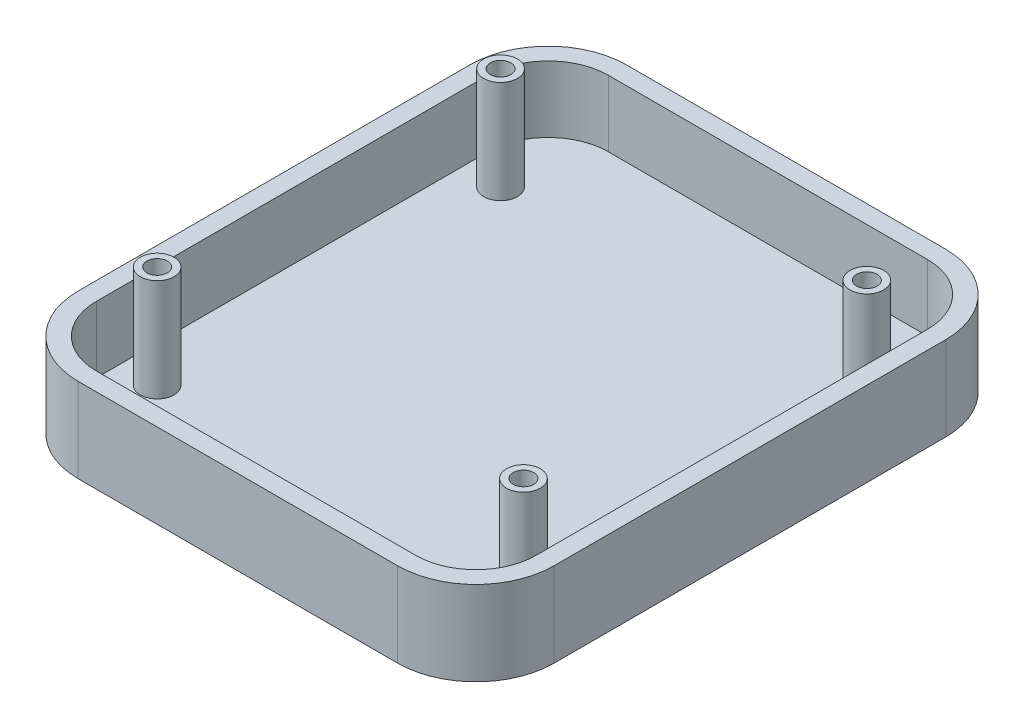
ISO-10303-21;
HEADER;
FILE_DESCRIPTION(('STEP AP214'),'2;1');
FILE_NAME('part.step','',(''),(''),'','','');
FILE_SCHEMA(('AUTOMOTIVE_DESIGN { 1 0 10303 214 1 1 1 1 }'));
ENDSEC;
DATA;
#1=APPLICATION_CONTEXT('core data for automotive mechanical design processes');
#2=APPLICATION_PROTOCOL_DEFINITION('international standard','automotive_design',2000,#1);
#3=PRODUCT_CONTEXT('',#1,'mechanical');
#4=PRODUCT('Part','Part','',(#3));
#5=PRODUCT_RELATED_PRODUCT_CATEGORY('part','',(#4));
#6=PRODUCT_DEFINITION_FORMATION('','',#4);
#7=PRODUCT_DEFINITION_CONTEXT('part definition',#1,'design');
#8=PRODUCT_DEFINITION('design','',#6,#7);
#9=PRODUCT_DEFINITION_SHAPE('','',#8);
#10=(LENGTH_UNIT() NAMED_UNIT(*) SI_UNIT(.MILLI.,.METRE.));
#11=(NAMED_UNIT(*) PLANE_ANGLE_UNIT() SI_UNIT($,.RADIAN.));
#12=(NAMED_UNIT(*) SI_UNIT($,.STERADIAN.) SOLID_ANGLE_UNIT());
#13=UNCERTAINTY_MEASURE_WITH_UNIT(LENGTH_MEASURE(1.E-05),#10,'distance_accuracy_value','');
#14=(GEOMETRIC_REPRESENTATION_CONTEXT(3) GLOBAL_UNCERTAINTY_ASSIGNED_CONTEXT((#13)) GLOBAL_UNIT_ASSIGNED_CONTEXT((#10,
#11,#12)) REPRESENTATION_CONTEXT('',''));
#15=CARTESIAN_POINT('',(0.,0.,0.));
#16=DIRECTION('',(0.,0.,1.));
#17=DIRECTION('',(1.,0.,0.));
#18=AXIS2_PLACEMENT_3D('',#15,#16,#17);
#19=CARTESIAN_POINT('',(0.,1.5,0.));
#20=DIRECTION('',(0.,1.,0.));
#21=DIRECTION('',(0.,0.,1.));
#22=AXIS2_PLACEMENT_3D('',#19,#20,#21);
#23=PLANE('',#22);
#24=CARTESIAN_POINT('',(15.2,1.5,-14.25));
#25=DIRECTION('',(0.,1.,0.));
#26=DIRECTION('',(0.,0.,-1.));
#27=AXIS2_PLACEMENT_3D('',#24,#25,#26);
#28=CIRCLE('',#27,1.4);
#29=CARTESIAN_POINT('',(15.2,1.5,-15.65));
#30=VERTEX_POINT('',#29);
#31=EDGE_CURVE('E266',#30,#30,#28,.T.);
#32=ORIENTED_EDGE('',*,*,#31,.F.);
#33=EDGE_LOOP('',(#32));
#34=FACE_BOUND('',#33,.T.);
#35=CARTESIAN_POINT('',(15.2,1.5,14.25));
#36=DIRECTION('',(0.,1.,0.));
#37=DIRECTION('',(0.,0.,1.));
#38=AXIS2_PLACEMENT_3D('',#35,#36,#37);
#39=CIRCLE('',#38,1.4);
#40=CARTESIAN_POINT('',(15.2,1.5,15.65));
#41=VERTEX_POINT('',#40);
#42=EDGE_CURVE('E275',#41,#41,#39,.T.);
#43=ORIENTED_EDGE('',*,*,#42,.F.);
#44=EDGE_LOOP('',(#43));
#45=FACE_BOUND('',#44,.T.);
#46=CARTESIAN_POINT('',(-15.2,1.5,14.25));
#47=DIRECTION('',(0.,1.,0.));
#48=DIRECTION('',(0.,0.,-1.));
#49=AXIS2_PLACEMENT_3D('',#46,#47,#48);
#50=CIRCLE('',#49,1.4);
#51=CARTESIAN_POINT('',(-15.2,1.5,12.85));
#52=VERTEX_POINT('',#51);
#53=EDGE_CURVE('E284',#52,#52,#50,.T.);
#54=ORIENTED_EDGE('',*,*,#53,.F.);
#55=EDGE_LOOP('',(#54));
#56=FACE_BOUND('',#55,.T.);
#57=CARTESIAN_POINT('',(-15.2,1.5,-14.25));
#58=DIRECTION('',(0.,1.,0.));
#59=DIRECTION('',(0.,0.,1.));
#60=AXIS2_PLACEMENT_3D('',#57,#58,#59);
#61=CIRCLE('',#60,1.4);
#62=CARTESIAN_POINT('',(-15.2,1.5,-12.85));
#63=VERTEX_POINT('',#62);
#64=EDGE_CURVE('E293',#63,#63,#61,.T.);
#65=ORIENTED_EDGE('',*,*,#64,.F.);
#66=EDGE_LOOP('',(#65));
#67=FACE_BOUND('',#66,.T.);
#68=DIRECTION('',(1.,0.,0.));
#69=VECTOR('',#68,1.);
#70=CARTESIAN_POINT('',(-18.25,1.5,21.25));
#71=LINE('',#70,#69);
#72=CARTESIAN_POINT('',(-13.25,1.5,21.25));
#73=VERTEX_POINT('',#72);
#74=CARTESIAN_POINT('',(13.25,1.5,21.25));
#75=VERTEX_POINT('',#74);
#76=EDGE_CURVE('E59',#73,#75,#71,.T.);
#77=ORIENTED_EDGE('',*,*,#76,.T.);
#78=CARTESIAN_POINT('',(13.25,1.5,16.25));
#79=DIRECTION('',(0.,1.,0.));
#80=DIRECTION('',(0.,0.,1.));
#81=AXIS2_PLACEMENT_3D('',#78,#79,#80);
#82=CIRCLE('',#81,5.);
#83=CARTESIAN_POINT('',(18.25,1.5,16.25));
#84=VERTEX_POINT('',#83);
#85=EDGE_CURVE('E317',#75,#84,#82,.T.);
#86=ORIENTED_EDGE('',*,*,#85,.T.);
#87=DIRECTION('',(0.,0.,-1.));
#88=VECTOR('',#87,1.);
#89=CARTESIAN_POINT('',(18.25,1.5,-21.25));
#90=LINE('',#89,#88);
#91=CARTESIAN_POINT('',(18.25,1.5,-16.25));
#92=VERTEX_POINT('',#91);
#93=EDGE_CURVE('E297',#84,#92,#90,.T.);
#94=ORIENTED_EDGE('',*,*,#93,.T.);
#95=CARTESIAN_POINT('',(13.25,1.5,-16.25));
#96=DIRECTION('',(0.,1.,0.));
#97=DIRECTION('',(0.,0.,1.));
#98=AXIS2_PLACEMENT_3D('',#95,#96,#97);
#99=CIRCLE('',#98,5.);
#100=CARTESIAN_POINT('',(13.25,1.5,-21.25));
#101=VERTEX_POINT('',#100);
#102=EDGE_CURVE('E309',#92,#101,#99,.T.);
#103=ORIENTED_EDGE('',*,*,#102,.T.);
#104=DIRECTION('',(-1.,0.,0.));
#105=VECTOR('',#104,1.);
#106=CARTESIAN_POINT('',(-18.25,1.5,-21.25));
#107=LINE('',#106,#105);
#108=CARTESIAN_POINT('',(-13.25,1.5,-21.25));
#109=VERTEX_POINT('',#108);
#110=EDGE_CURVE('E302',#101,#109,#107,.T.);
#111=ORIENTED_EDGE('',*,*,#110,.T.);
#112=CARTESIAN_POINT('',(-13.25,1.5,-16.25));
#113=DIRECTION('',(0.,1.,0.));
#114=DIRECTION('',(0.,0.,1.));
#115=AXIS2_PLACEMENT_3D('',#112,#113,#114);
#116=CIRCLE('',#115,5.);
#117=CARTESIAN_POINT('',(-18.25,1.5,-16.25));
#118=VERTEX_POINT('',#117);
#119=EDGE_CURVE('E312',#109,#118,#116,.T.);
#120=ORIENTED_EDGE('',*,*,#119,.T.);
#121=DIRECTION('',(0.,0.,1.));
#122=VECTOR('',#121,1.);
#123=CARTESIAN_POINT('',(-18.25,1.5,-21.25));
#124=LINE('',#123,#122);
#125=CARTESIAN_POINT('',(-18.25,1.5,16.25));
#126=VERTEX_POINT('',#125);
#127=EDGE_CURVE('E305',#118,#126,#124,.T.);
#128=ORIENTED_EDGE('',*,*,#127,.T.);
#129=CARTESIAN_POINT('',(-13.25,1.5,16.25));
#130=DIRECTION('',(0.,1.,0.));
#131=DIRECTION('',(0.,0.,1.));
#132=AXIS2_PLACEMENT_3D('',#129,#130,#131);
#133=CIRCLE('',#132,5.);
#134=EDGE_CURVE('E315',#126,#73,#133,.T.);
#135=ORIENTED_EDGE('',*,*,#134,.T.);
#136=EDGE_LOOP('',(#77,#86,#94,#103,#111,#120,#128,#135));
#137=FACE_BOUND('',#136,.T.);
#138=ADVANCED_FACE('F39',(#34,#45,#56,#67,#137),#23,.T.);
#139=CARTESIAN_POINT('',(-15.2,10.,-14.25));
#140=DIRECTION('',(0.,1.,0.));
#141=DIRECTION('',(0.,0.,1.));
#142=AXIS2_PLACEMENT_3D('',#139,#140,#141);
#143=PLANE('',#142);
#144=CARTESIAN_POINT('',(-15.2,10.,-14.25));
#145=DIRECTION('',(0.,1.,0.));
#146=DIRECTION('',(0.,0.,1.));
#147=AXIS2_PLACEMENT_3D('',#144,#145,#146);
#148=CIRCLE('',#147,1.4);
#149=CARTESIAN_POINT('',(-15.2,10.,-12.85));
#150=VERTEX_POINT('',#149);
#151=EDGE_CURVE('E294',#150,#150,#148,.T.);
#152=ORIENTED_EDGE('',*,*,#151,.T.);
#153=EDGE_LOOP('',(#152));
#154=FACE_BOUND('',#153,.T.);
#155=CARTESIAN_POINT('',(-15.2,10.,-14.25));
#156=DIRECTION('',(0.,1.,0.));
#157=DIRECTION('',(0.,0.,1.));
#158=AXIS2_PLACEMENT_3D('',#155,#156,#157);
#159=CIRCLE('',#158,0.85);
#160=CARTESIAN_POINT('',(-15.2,10.,-13.4));
#161=VERTEX_POINT('',#160);
#162=EDGE_CURVE('E288',#161,#161,#159,.T.);
#163=ORIENTED_EDGE('',*,*,#162,.F.);
#164=EDGE_LOOP('',(#163));
#165=FACE_BOUND('',#164,.T.);
#166=ADVANCED_FACE('F356',(#154,#165),#143,.T.);
#167=CARTESIAN_POINT('',(-15.2,10.,-14.25));
#168=DIRECTION('',(0.,-1.,0.));
#169=DIRECTION('',(0.,0.,-1.));
#170=AXIS2_PLACEMENT_3D('',#167,#168,#169);
#171=CYLINDRICAL_SURFACE('',#170,1.4);
#172=ORIENTED_EDGE('',*,*,#151,.F.);
#173=EDGE_LOOP('',(#172));
#174=FACE_BOUND('',#173,.T.);
#175=ORIENTED_EDGE('',*,*,#64,.T.);
#176=EDGE_LOOP('',(#175));
#177=FACE_BOUND('',#176,.T.);
#178=ADVANCED_FACE('F362',(#174,#177),#171,.T.);
#179=CARTESIAN_POINT('',(-15.2,10.,-14.25));
#180=DIRECTION('',(0.,-1.,0.));
#181=DIRECTION('',(0.,0.,-1.));
#182=AXIS2_PLACEMENT_3D('',#179,#180,#181);
#183=CYLINDRICAL_SURFACE('',#182,0.85);
#184=ORIENTED_EDGE('',*,*,#162,.T.);
#185=EDGE_LOOP('',(#184));
#186=FACE_BOUND('',#185,.T.);
#187=CARTESIAN_POINT('',(-15.2,1.5,-14.25));
#188=DIRECTION('',(0.,1.,0.));
#189=DIRECTION('',(0.,0.,1.));
#190=AXIS2_PLACEMENT_3D('',#187,#188,#189);
#191=CIRCLE('',#190,0.85);
#192=CARTESIAN_POINT('',(-15.2,1.5,-13.4));
#193=VERTEX_POINT('',#192);
#194=EDGE_CURVE('E320',#193,#193,#191,.F.);
#195=ORIENTED_EDGE('',*,*,#194,.T.);
#196=EDGE_LOOP('',(#195));
#197=FACE_BOUND('',#196,.T.);
#198=ADVANCED_FACE('F369',(#186,#197),#183,.F.);
#199=ORIENTED_EDGE('',*,*,#194,.F.);
#200=EDGE_LOOP('',(#199));
#201=FACE_BOUND('',#200,.T.);
#202=ADVANCED_FACE('F350',(#201),#23,.T.);
#203=CARTESIAN_POINT('',(-15.2,10.,14.25));
#204=DIRECTION('',(0.,-1.,0.));
#205=DIRECTION('',(0.,0.,-1.));
#206=AXIS2_PLACEMENT_3D('',#203,#204,#205);
#207=PLANE('',#206);
#208=CARTESIAN_POINT('',(-15.2,10.,14.25));
#209=DIRECTION('',(0.,1.,0.));
#210=DIRECTION('',(0.,0.,-1.));
#211=AXIS2_PLACEMENT_3D('',#208,#209,#210);
#212=CIRCLE('',#211,1.4);
#213=CARTESIAN_POINT('',(-15.2,10.,12.85));
#214=VERTEX_POINT('',#213);
#215=EDGE_CURVE('E285',#214,#214,#212,.T.);
#216=ORIENTED_EDGE('',*,*,#215,.T.);
#217=EDGE_LOOP('',(#216));
#218=FACE_BOUND('',#217,.T.);
#219=CARTESIAN_POINT('',(-15.2,10.,14.25));
#220=DIRECTION('',(0.,1.,0.));
#221=DIRECTION('',(0.,0.,-1.));
#222=AXIS2_PLACEMENT_3D('',#219,#220,#221);
#223=CIRCLE('',#222,0.85);
#224=CARTESIAN_POINT('',(-15.2,10.,13.4));
#225=VERTEX_POINT('',#224);
#226=EDGE_CURVE('E279',#225,#225,#223,.T.);
#227=ORIENTED_EDGE('',*,*,#226,.F.);
#228=EDGE_LOOP('',(#227));
#229=FACE_BOUND('',#228,.T.);
#230=ADVANCED_FACE('F368',(#218,#229),#207,.F.);
#231=CARTESIAN_POINT('',(-15.2,10.,14.25));
#232=DIRECTION('',(0.,-1.,0.));
#233=DIRECTION('',(0.,0.,-1.));
#234=AXIS2_PLACEMENT_3D('',#231,#232,#233);
#235=CYLINDRICAL_SURFACE('',#234,1.4);
#236=ORIENTED_EDGE('',*,*,#215,.F.);
#237=EDGE_LOOP('',(#236));
#238=FACE_BOUND('',#237,.T.);
#239=ORIENTED_EDGE('',*,*,#53,.T.);
#240=EDGE_LOOP('',(#239));
#241=FACE_BOUND('',#240,.T.);
#242=ADVANCED_FACE('F375',(#238,#241),#235,.T.);
#243=CARTESIAN_POINT('',(-15.2,10.,14.25));
#244=DIRECTION('',(0.,-1.,0.));
#245=DIRECTION('',(0.,0.,-1.));
#246=AXIS2_PLACEMENT_3D('',#243,#244,#245);
#247=CYLINDRICAL_SURFACE('',#246,0.85);
#248=ORIENTED_EDGE('',*,*,#226,.T.);
#249=EDGE_LOOP('',(#248));
#250=FACE_BOUND('',#249,.T.);
#251=CARTESIAN_POINT('',(-15.2,1.5,14.25));
#252=DIRECTION('',(0.,1.,0.));
#253=DIRECTION('',(0.,0.,1.));
#254=AXIS2_PLACEMENT_3D('',#251,#252,#253);
#255=CIRCLE('',#254,0.85);
#256=CARTESIAN_POINT('',(-15.2,1.5,15.1));
#257=VERTEX_POINT('',#256);
#258=EDGE_CURVE('E323',#257,#257,#255,.F.);
#259=ORIENTED_EDGE('',*,*,#258,.T.);
#260=EDGE_LOOP('',(#259));
#261=FACE_BOUND('',#260,.T.);
#262=ADVANCED_FACE('F348',(#250,#261),#247,.F.);
#263=ORIENTED_EDGE('',*,*,#258,.F.);
#264=EDGE_LOOP('',(#263));
#265=FACE_BOUND('',#264,.T.);
#266=ADVANCED_FACE('F333',(#265),#23,.T.);
#267=CARTESIAN_POINT('',(15.2,10.,14.25));
#268=DIRECTION('',(0.,1.,0.));
#269=DIRECTION('',(0.,0.,1.));
#270=AXIS2_PLACEMENT_3D('',#267,#268,#269);
#271=PLANE('',#270);
#272=CARTESIAN_POINT('',(15.2,10.,14.25));
#273=DIRECTION('',(0.,1.,0.));
#274=DIRECTION('',(0.,0.,1.));
#275=AXIS2_PLACEMENT_3D('',#272,#273,#274);
#276=CIRCLE('',#275,1.4);
#277=CARTESIAN_POINT('',(15.2,10.,15.65));
#278=VERTEX_POINT('',#277);
#279=EDGE_CURVE('E276',#278,#278,#276,.T.);
#280=ORIENTED_EDGE('',*,*,#279,.T.);
#281=EDGE_LOOP('',(#280));
#282=FACE_BOUND('',#281,.T.);
#283=CARTESIAN_POINT('',(15.2,10.,14.25));
#284=DIRECTION('',(0.,1.,0.));
#285=DIRECTION('',(0.,0.,1.));
#286=AXIS2_PLACEMENT_3D('',#283,#284,#285);
#287=CIRCLE('',#286,0.85);
#288=CARTESIAN_POINT('',(15.2,10.,15.1));
#289=VERTEX_POINT('',#288);
#290=EDGE_CURVE('E270',#289,#289,#287,.T.);
#291=ORIENTED_EDGE('',*,*,#290,.F.);
#292=EDGE_LOOP('',(#291));
#293=FACE_BOUND('',#292,.T.);
#294=ADVANCED_FACE('F347',(#282,#293),#271,.T.);
#295=CARTESIAN_POINT('',(15.2,10.,14.25));
#296=DIRECTION('',(0.,-1.,0.));
#297=DIRECTION('',(0.,0.,-1.));
#298=AXIS2_PLACEMENT_3D('',#295,#296,#297);
#299=CYLINDRICAL_SURFACE('',#298,1.4);
#300=ORIENTED_EDGE('',*,*,#279,.F.);
#301=EDGE_LOOP('',(#300));
#302=FACE_BOUND('',#301,.T.);
#303=ORIENTED_EDGE('',*,*,#42,.T.);
#304=EDGE_LOOP('',(#303));
#305=FACE_BOUND('',#304,.T.);
#306=ADVANCED_FACE('F342',(#302,#305),#299,.T.);
#307=CARTESIAN_POINT('',(15.2,10.,14.25));
#308=DIRECTION('',(0.,-1.,0.));
#309=DIRECTION('',(0.,0.,-1.));
#310=AXIS2_PLACEMENT_3D('',#307,#308,#309);
#311=CYLINDRICAL_SURFACE('',#310,0.85);
#312=ORIENTED_EDGE('',*,*,#290,.T.);
#313=EDGE_LOOP('',(#312));
#314=FACE_BOUND('',#313,.T.);
#315=CARTESIAN_POINT('',(15.2,1.5,14.25));
#316=DIRECTION('',(0.,1.,0.));
#317=DIRECTION('',(0.,0.,1.));
#318=AXIS2_PLACEMENT_3D('',#315,#316,#317);
#319=CIRCLE('',#318,0.85);
#320=CARTESIAN_POINT('',(15.2,1.5,15.1));
#321=VERTEX_POINT('',#320);
#322=EDGE_CURVE('E47',#321,#321,#319,.F.);
#323=ORIENTED_EDGE('',*,*,#322,.T.);
#324=EDGE_LOOP('',(#323));
#325=FACE_BOUND('',#324,.T.);
#326=ADVANCED_FACE('F328',(#314,#325),#311,.F.);
#327=ORIENTED_EDGE('',*,*,#322,.F.);
#328=EDGE_LOOP('',(#327));
#329=FACE_BOUND('',#328,.T.);
#330=ADVANCED_FACE('F330',(#329),#23,.T.);
#331=CARTESIAN_POINT('',(15.2,10.,-14.25));
#332=DIRECTION('',(0.,-1.,0.));
#333=DIRECTION('',(0.,0.,-1.));
#334=AXIS2_PLACEMENT_3D('',#331,#332,#333);
#335=PLANE('',#334);
#336=CARTESIAN_POINT('',(15.2,10.,-14.25));
#337=DIRECTION('',(0.,1.,0.));
#338=DIRECTION('',(0.,0.,-1.));
#339=AXIS2_PLACEMENT_3D('',#336,#337,#338);
#340=CIRCLE('',#339,1.4);
#341=CARTESIAN_POINT('',(15.2,10.,-15.65));
#342=VERTEX_POINT('',#341);
#343=EDGE_CURVE('E267',#342,#342,#340,.T.);
#344=ORIENTED_EDGE('',*,*,#343,.T.);
#345=EDGE_LOOP('',(#344));
#346=FACE_BOUND('',#345,.T.);
#347=CARTESIAN_POINT('',(15.2,10.,-14.25));
#348=DIRECTION('',(0.,1.,0.));
#349=DIRECTION('',(0.,0.,-1.));
#350=AXIS2_PLACEMENT_3D('',#347,#348,#349);
#351=CIRCLE('',#350,0.85);
#352=CARTESIAN_POINT('',(15.2,10.,-15.1));
#353=VERTEX_POINT('',#352);
#354=EDGE_CURVE('E250',#353,#353,#351,.T.);
#355=ORIENTED_EDGE('',*,*,#354,.F.);
#356=EDGE_LOOP('',(#355));
#357=FACE_BOUND('',#356,.T.);
#358=ADVANCED_FACE('F332',(#346,#357),#335,.F.);
#359=CARTESIAN_POINT('',(15.2,10.,-14.25));
#360=DIRECTION('',(0.,-1.,0.));
#361=DIRECTION('',(0.,0.,-1.));
#362=AXIS2_PLACEMENT_3D('',#359,#360,#361);
#363=CYLINDRICAL_SURFACE('',#362,1.4);
#364=ORIENTED_EDGE('',*,*,#343,.F.);
#365=EDGE_LOOP('',(#364));
#366=FACE_BOUND('',#365,.T.);
#367=ORIENTED_EDGE('',*,*,#31,.T.);
#368=EDGE_LOOP('',(#367));
#369=FACE_BOUND('',#368,.T.);
#370=ADVANCED_FACE('F339',(#366,#369),#363,.T.);
#371=CARTESIAN_POINT('',(15.2,10.,-14.25));
#372=DIRECTION('',(0.,-1.,0.));
#373=DIRECTION('',(0.,0.,-1.));
#374=AXIS2_PLACEMENT_3D('',#371,#372,#373);
#375=CYLINDRICAL_SURFACE('',#374,0.85);
#376=ORIENTED_EDGE('',*,*,#354,.T.);
#377=EDGE_LOOP('',(#376));
#378=FACE_BOUND('',#377,.T.);
#379=CARTESIAN_POINT('',(15.2,1.5,-14.25));
#380=DIRECTION('',(0.,1.,0.));
#381=DIRECTION('',(0.,0.,1.));
#382=AXIS2_PLACEMENT_3D('',#379,#380,#381);
#383=CIRCLE('',#382,0.85);
#384=CARTESIAN_POINT('',(15.2,1.5,-13.4));
#385=VERTEX_POINT('',#384);
#386=EDGE_CURVE('E11',#385,#385,#383,.F.);
#387=ORIENTED_EDGE('',*,*,#386,.T.);
#388=EDGE_LOOP('',(#387));
#389=FACE_BOUND('',#388,.T.);
#390=ADVANCED_FACE('F353',(#378,#389),#375,.F.);
#391=ORIENTED_EDGE('',*,*,#386,.F.);
#392=EDGE_LOOP('',(#391));
#393=FACE_BOUND('',#392,.T.);
#394=ADVANCED_FACE('F334',(#393),#23,.T.);
#395=CARTESIAN_POINT('',(-13.25,0.,16.25));
#396=DIRECTION('',(0.,1.,0.));
#397=DIRECTION('',(0.,0.,1.));
#398=AXIS2_PLACEMENT_3D('',#395,#396,#397);
#399=CYLINDRICAL_SURFACE('',#398,6.50000000000001);
#400=DIRECTION('',(0.,1.,0.));
#401=VECTOR('',#400,1.);
#402=CARTESIAN_POINT('',(-13.25,0.,22.75));
#403=LINE('',#402,#401);
#404=CARTESIAN_POINT('',(-13.25,0.,22.75));
#405=VERTEX_POINT('',#404);
#406=CARTESIAN_POINT('',(-13.25,7.,22.75));
#407=VERTEX_POINT('',#406);
#408=EDGE_CURVE('E247',#405,#407,#403,.T.);
#409=ORIENTED_EDGE('',*,*,#408,.T.);
#410=CARTESIAN_POINT('',(-13.25,7.,16.25));
#411=DIRECTION('',(0.,1.,0.));
#412=DIRECTION('',(0.,0.,1.));
#413=AXIS2_PLACEMENT_3D('',#410,#411,#412);
#414=CIRCLE('',#413,6.50000000000001);
#415=CARTESIAN_POINT('',(-19.75,7.,16.25));
#416=VERTEX_POINT('',#415);
#417=EDGE_CURVE('E188',#416,#407,#414,.T.);
#418=ORIENTED_EDGE('',*,*,#417,.F.);
#419=DIRECTION('',(0.,1.,0.));
#420=VECTOR('',#419,1.);
#421=CARTESIAN_POINT('',(-19.75,0.,16.25));
#422=LINE('',#421,#420);
#423=CARTESIAN_POINT('',(-19.75,0.,16.25));
#424=VERTEX_POINT('',#423);
#425=EDGE_CURVE('E248',#424,#416,#422,.T.);
#426=ORIENTED_EDGE('',*,*,#425,.F.);
#427=CARTESIAN_POINT('',(-13.25,0.,16.25));
#428=DIRECTION('',(0.,1.,0.));
#429=DIRECTION('',(0.,0.,1.));
#430=AXIS2_PLACEMENT_3D('',#427,#428,#429);
#431=CIRCLE('',#430,6.50000000000001);
#432=EDGE_CURVE('E212',#424,#405,#431,.T.);
#433=ORIENTED_EDGE('',*,*,#432,.T.);
#434=EDGE_LOOP('',(#409,#418,#426,#433));
#435=FACE_BOUND('',#434,.T.);
#436=ADVANCED_FACE('F352',(#435),#399,.T.);
#437=CARTESIAN_POINT('',(-19.75,0.,-16.25));
#438=DIRECTION('',(-1.,0.,0.));
#439=DIRECTION('',(0.,0.,1.));
#440=AXIS2_PLACEMENT_3D('',#437,#438,#439);
#441=PLANE('',#440);
#442=ORIENTED_EDGE('',*,*,#425,.T.);
#443=DIRECTION('',(0.,0.,1.));
#444=VECTOR('',#443,1.);
#445=CARTESIAN_POINT('',(-19.75,7.,-16.25));
#446=LINE('',#445,#444);
#447=CARTESIAN_POINT('',(-19.75,7.,-16.25));
#448=VERTEX_POINT('',#447);
#449=EDGE_CURVE('E156',#448,#416,#446,.T.);
#450=ORIENTED_EDGE('',*,*,#449,.F.);
#451=DIRECTION('',(0.,1.,0.));
#452=VECTOR('',#451,1.);
#453=CARTESIAN_POINT('',(-19.75,0.,-16.25));
#454=LINE('',#453,#452);
#455=CARTESIAN_POINT('',(-19.75,0.,-16.25));
#456=VERTEX_POINT('',#455);
#457=EDGE_CURVE('E251',#456,#448,#454,.T.);
#458=ORIENTED_EDGE('',*,*,#457,.F.);
#459=DIRECTION('',(0.,0.,1.));
#460=VECTOR('',#459,1.);
#461=CARTESIAN_POINT('',(-19.75,0.,-16.25));
#462=LINE('',#461,#460);
#463=EDGE_CURVE('E244',#456,#424,#462,.T.);
#464=ORIENTED_EDGE('',*,*,#463,.T.);
#465=EDGE_LOOP('',(#442,#450,#458,#464));
#466=FACE_BOUND('',#465,.T.);
#467=ADVANCED_FACE('F406',(#466),#441,.T.);
#468=CARTESIAN_POINT('',(-13.25,0.,-16.25));
#469=DIRECTION('',(0.,1.,0.));
#470=DIRECTION('',(0.,0.,1.));
#471=AXIS2_PLACEMENT_3D('',#468,#469,#470);
#472=CYLINDRICAL_SURFACE('',#471,6.5);
#473=ORIENTED_EDGE('',*,*,#457,.T.);
#474=CARTESIAN_POINT('',(-13.25,7.,-16.25));
#475=DIRECTION('',(0.,1.,0.));
#476=DIRECTION('',(0.,0.,1.));
#477=AXIS2_PLACEMENT_3D('',#474,#475,#476);
#478=CIRCLE('',#477,6.5);
#479=CARTESIAN_POINT('',(-13.25,7.,-22.75));
#480=VERTEX_POINT('',#479);
#481=EDGE_CURVE('E206',#480,#448,#478,.T.);
#482=ORIENTED_EDGE('',*,*,#481,.F.);
#483=DIRECTION('',(0.,1.,0.));
#484=VECTOR('',#483,1.);
#485=CARTESIAN_POINT('',(-13.25,0.,-22.75));
#486=LINE('',#485,#484);
#487=CARTESIAN_POINT('',(-13.25,0.,-22.75));
#488=VERTEX_POINT('',#487);
#489=EDGE_CURVE('E253',#488,#480,#486,.T.);
#490=ORIENTED_EDGE('',*,*,#489,.F.);
#491=CARTESIAN_POINT('',(-13.25,0.,-16.25));
#492=DIRECTION('',(0.,1.,0.));
#493=DIRECTION('',(0.,0.,1.));
#494=AXIS2_PLACEMENT_3D('',#491,#492,#493);
#495=CIRCLE('',#494,6.5);
#496=EDGE_CURVE('E241',#488,#456,#495,.T.);
#497=ORIENTED_EDGE('',*,*,#496,.T.);
#498=EDGE_LOOP('',(#473,#482,#490,#497));
#499=FACE_BOUND('',#498,.T.);
#500=ADVANCED_FACE('F427',(#499),#472,.T.);
#501=CARTESIAN_POINT('',(13.25,0.,-22.75));
#502=DIRECTION('',(0.,0.,-1.));
#503=DIRECTION('',(-1.,0.,0.));
#504=AXIS2_PLACEMENT_3D('',#501,#502,#503);
#505=PLANE('',#504);
#506=ORIENTED_EDGE('',*,*,#489,.T.);
#507=DIRECTION('',(-1.,0.,0.));
#508=VECTOR('',#507,1.);
#509=CARTESIAN_POINT('',(13.25,7.,-22.75));
#510=LINE('',#509,#508);
#511=CARTESIAN_POINT('',(13.25,7.,-22.75));
#512=VERTEX_POINT('',#511);
#513=EDGE_CURVE('E203',#512,#480,#510,.T.);
#514=ORIENTED_EDGE('',*,*,#513,.F.);
#515=DIRECTION('',(0.,1.,0.));
#516=VECTOR('',#515,1.);
#517=CARTESIAN_POINT('',(13.25,0.,-22.75));
#518=LINE('',#517,#516);
#519=CARTESIAN_POINT('',(13.25,0.,-22.75));
#520=VERTEX_POINT('',#519);
#521=EDGE_CURVE('E255',#520,#512,#518,.T.);
#522=ORIENTED_EDGE('',*,*,#521,.F.);
#523=DIRECTION('',(-1.,0.,0.));
#524=VECTOR('',#523,1.);
#525=CARTESIAN_POINT('',(13.25,0.,-22.75));
#526=LINE('',#525,#524);
#527=EDGE_CURVE('E238',#520,#488,#526,.T.);
#528=ORIENTED_EDGE('',*,*,#527,.T.);
#529=EDGE_LOOP('',(#506,#514,#522,#528));
#530=FACE_BOUND('',#529,.T.);
#531=ADVANCED_FACE('F423',(#530),#505,.T.);
#532=CARTESIAN_POINT('',(13.25,0.,-16.25));
#533=DIRECTION('',(0.,1.,0.));
#534=DIRECTION('',(0.,0.,1.));
#535=AXIS2_PLACEMENT_3D('',#532,#533,#534);
#536=CYLINDRICAL_SURFACE('',#535,6.5);
#537=ORIENTED_EDGE('',*,*,#521,.T.);
#538=CARTESIAN_POINT('',(13.25,7.,-16.25));
#539=DIRECTION('',(0.,1.,0.));
#540=DIRECTION('',(0.,0.,1.));
#541=AXIS2_PLACEMENT_3D('',#538,#539,#540);
#542=CIRCLE('',#541,6.5);
#543=CARTESIAN_POINT('',(19.75,7.,-16.25));
#544=VERTEX_POINT('',#543);
#545=EDGE_CURVE('E200',#544,#512,#542,.T.);
#546=ORIENTED_EDGE('',*,*,#545,.F.);
#547=DIRECTION('',(0.,1.,0.));
#548=VECTOR('',#547,1.);
#549=CARTESIAN_POINT('',(19.75,0.,-16.25));
#550=LINE('',#549,#548);
#551=CARTESIAN_POINT('',(19.75,0.,-16.25));
#552=VERTEX_POINT('',#551);
#553=EDGE_CURVE('E257',#552,#544,#550,.T.);
#554=ORIENTED_EDGE('',*,*,#553,.F.);
#555=CARTESIAN_POINT('',(13.25,0.,-16.25));
#556=DIRECTION('',(0.,1.,0.));
#557=DIRECTION('',(0.,0.,1.));
#558=AXIS2_PLACEMENT_3D('',#555,#556,#557);
#559=CIRCLE('',#558,6.5);
#560=EDGE_CURVE('E235',#552,#520,#559,.T.);
#561=ORIENTED_EDGE('',*,*,#560,.T.);
#562=EDGE_LOOP('',(#537,#546,#554,#561));
#563=FACE_BOUND('',#562,.T.);
#564=ADVANCED_FACE('F419',(#563),#536,.T.);
#565=CARTESIAN_POINT('',(19.75,0.,16.25));
#566=DIRECTION('',(1.,0.,0.));
#567=DIRECTION('',(0.,0.,-1.));
#568=AXIS2_PLACEMENT_3D('',#565,#566,#567);
#569=PLANE('',#568);
#570=ORIENTED_EDGE('',*,*,#553,.T.);
#571=DIRECTION('',(0.,0.,-1.));
#572=VECTOR('',#571,1.);
#573=CARTESIAN_POINT('',(19.75,7.,16.25));
#574=LINE('',#573,#572);
#575=CARTESIAN_POINT('',(19.75,7.,16.25));
#576=VERTEX_POINT('',#575);
#577=EDGE_CURVE('E197',#576,#544,#574,.T.);
#578=ORIENTED_EDGE('',*,*,#577,.F.);
#579=DIRECTION('',(0.,1.,0.));
#580=VECTOR('',#579,1.);
#581=CARTESIAN_POINT('',(19.75,0.,16.25));
#582=LINE('',#581,#580);
#583=CARTESIAN_POINT('',(19.75,0.,16.25));
#584=VERTEX_POINT('',#583);
#585=EDGE_CURVE('E259',#584,#576,#582,.T.);
#586=ORIENTED_EDGE('',*,*,#585,.F.);
#587=DIRECTION('',(0.,0.,-1.));
#588=VECTOR('',#587,1.);
#589=CARTESIAN_POINT('',(19.75,0.,16.25));
#590=LINE('',#589,#588);
#591=EDGE_CURVE('E232',#584,#552,#590,.T.);
#592=ORIENTED_EDGE('',*,*,#591,.T.);
#593=EDGE_LOOP('',(#570,#578,#586,#592));
#594=FACE_BOUND('',#593,.T.);
#595=ADVANCED_FACE('F415',(#594),#569,.T.);
#596=CARTESIAN_POINT('',(13.25,0.,16.25));
#597=DIRECTION('',(0.,1.,0.));
#598=DIRECTION('',(0.,0.,1.));
#599=AXIS2_PLACEMENT_3D('',#596,#597,#598);
#600=CYLINDRICAL_SURFACE('',#599,6.5);
#601=ORIENTED_EDGE('',*,*,#585,.T.);
#602=CARTESIAN_POINT('',(13.25,7.,16.25));
#603=DIRECTION('',(0.,1.,0.));
#604=DIRECTION('',(0.,0.,1.));
#605=AXIS2_PLACEMENT_3D('',#602,#603,#604);
#606=CIRCLE('',#605,6.5);
#607=CARTESIAN_POINT('',(13.25,7.,22.75));
#608=VERTEX_POINT('',#607);
#609=EDGE_CURVE('E194',#608,#576,#606,.T.);
#610=ORIENTED_EDGE('',*,*,#609,.F.);
#611=DIRECTION('',(0.,1.,0.));
#612=VECTOR('',#611,1.);
#613=CARTESIAN_POINT('',(13.25,0.,22.75));
#614=LINE('',#613,#612);
#615=CARTESIAN_POINT('',(13.25,0.,22.75));
#616=VERTEX_POINT('',#615);
#617=EDGE_CURVE('E261',#616,#608,#614,.T.);
#618=ORIENTED_EDGE('',*,*,#617,.F.);
#619=CARTESIAN_POINT('',(13.25,0.,16.25));
#620=DIRECTION('',(0.,1.,0.));
#621=DIRECTION('',(0.,0.,1.));
#622=AXIS2_PLACEMENT_3D('',#619,#620,#621);
#623=CIRCLE('',#622,6.5);
#624=EDGE_CURVE('E229',#616,#584,#623,.T.);
#625=ORIENTED_EDGE('',*,*,#624,.T.);
#626=EDGE_LOOP('',(#601,#610,#618,#625));
#627=FACE_BOUND('',#626,.T.);
#628=ADVANCED_FACE('F411',(#627),#600,.T.);
#629=CARTESIAN_POINT('',(-13.25,0.,22.75));
#630=DIRECTION('',(0.,0.,1.));
#631=DIRECTION('',(1.,0.,0.));
#632=AXIS2_PLACEMENT_3D('',#629,#630,#631);
#633=PLANE('',#632);
#634=ORIENTED_EDGE('',*,*,#617,.T.);
#635=DIRECTION('',(1.,0.,0.));
#636=VECTOR('',#635,1.);
#637=CARTESIAN_POINT('',(-13.25,7.,22.75));
#638=LINE('',#637,#636);
#639=EDGE_CURVE('E191',#407,#608,#638,.T.);
#640=ORIENTED_EDGE('',*,*,#639,.F.);
#641=ORIENTED_EDGE('',*,*,#408,.F.);
#642=DIRECTION('',(1.,0.,0.));
#643=VECTOR('',#642,1.);
#644=CARTESIAN_POINT('',(-13.25,0.,22.75));
#645=LINE('',#644,#643);
#646=EDGE_CURVE('E226',#405,#616,#645,.T.);
#647=ORIENTED_EDGE('',*,*,#646,.T.);
#648=EDGE_LOOP('',(#634,#640,#641,#647));
#649=FACE_BOUND('',#648,.T.);
#650=ADVANCED_FACE('F408',(#649),#633,.T.);
#651=CARTESIAN_POINT('',(-13.25,0.,16.25));
#652=DIRECTION('',(0.,1.,0.));
#653=DIRECTION('',(0.,0.,1.));
#654=AXIS2_PLACEMENT_3D('',#651,#652,#653);
#655=CYLINDRICAL_SURFACE('',#654,5.);
#656=ORIENTED_EDGE('',*,*,#134,.F.);
#657=DIRECTION('',(0.,1.,0.));
#658=VECTOR('',#657,1.);
#659=CARTESIAN_POINT('',(-18.25,0.,16.25));
#660=LINE('',#659,#658);
#661=CARTESIAN_POINT('',(-18.25,7.,16.25));
#662=VERTEX_POINT('',#661);
#663=EDGE_CURVE('E162',#126,#662,#660,.T.);
#664=ORIENTED_EDGE('',*,*,#663,.T.);
#665=CARTESIAN_POINT('',(-13.25,7.,16.25));
#666=DIRECTION('',(0.,1.,0.));
#667=DIRECTION('',(0.,0.,1.));
#668=AXIS2_PLACEMENT_3D('',#665,#666,#667);
#669=CIRCLE('',#668,5.);
#670=CARTESIAN_POINT('',(-13.25,7.,21.25));
#671=VERTEX_POINT('',#670);
#672=EDGE_CURVE('E159',#662,#671,#669,.T.);
#673=ORIENTED_EDGE('',*,*,#672,.T.);
#674=DIRECTION('',(0.,1.,0.));
#675=VECTOR('',#674,1.);
#676=CARTESIAN_POINT('',(-13.25,0.,21.25));
#677=LINE('',#676,#675);
#678=EDGE_CURVE('E148',#73,#671,#677,.T.);
#679=ORIENTED_EDGE('',*,*,#678,.F.);
#680=EDGE_LOOP('',(#656,#664,#673,#679));
#681=FACE_BOUND('',#680,.T.);
#682=ADVANCED_FACE('F160',(#681),#655,.F.);
#683=CARTESIAN_POINT('',(-18.25,0.,-16.25));
#684=DIRECTION('',(-1.,0.,0.));
#685=DIRECTION('',(0.,0.,1.));
#686=AXIS2_PLACEMENT_3D('',#683,#684,#685);
#687=PLANE('',#686);
#688=ORIENTED_EDGE('',*,*,#127,.F.);
#689=DIRECTION('',(0.,1.,0.));
#690=VECTOR('',#689,1.);
#691=CARTESIAN_POINT('',(-18.25,0.,-16.25));
#692=LINE('',#691,#690);
#693=CARTESIAN_POINT('',(-18.25,7.,-16.25));
#694=VERTEX_POINT('',#693);
#695=EDGE_CURVE('E213',#118,#694,#692,.T.);
#696=ORIENTED_EDGE('',*,*,#695,.T.);
#697=DIRECTION('',(0.,0.,1.));
#698=VECTOR('',#697,1.);
#699=CARTESIAN_POINT('',(-18.25,7.,-16.25));
#700=LINE('',#699,#698);
#701=EDGE_CURVE('E186',#694,#662,#700,.T.);
#702=ORIENTED_EDGE('',*,*,#701,.T.);
#703=ORIENTED_EDGE('',*,*,#663,.F.);
#704=EDGE_LOOP('',(#688,#696,#702,#703));
#705=FACE_BOUND('',#704,.T.);
#706=ADVANCED_FACE('F437',(#705),#687,.F.);
#707=CARTESIAN_POINT('',(-13.25,0.,-16.25));
#708=DIRECTION('',(0.,1.,0.));
#709=DIRECTION('',(0.,0.,1.));
#710=AXIS2_PLACEMENT_3D('',#707,#708,#709);
#711=CYLINDRICAL_SURFACE('',#710,5.);
#712=ORIENTED_EDGE('',*,*,#119,.F.);
#713=DIRECTION('',(0.,1.,0.));
#714=VECTOR('',#713,1.);
#715=CARTESIAN_POINT('',(-13.25,0.,-21.25));
#716=LINE('',#715,#714);
#717=CARTESIAN_POINT('',(-13.25,7.,-21.25));
#718=VERTEX_POINT('',#717);
#719=EDGE_CURVE('E215',#109,#718,#716,.T.);
#720=ORIENTED_EDGE('',*,*,#719,.T.);
#721=CARTESIAN_POINT('',(-13.25,7.,-16.25));
#722=DIRECTION('',(0.,1.,0.));
#723=DIRECTION('',(0.,0.,1.));
#724=AXIS2_PLACEMENT_3D('',#721,#722,#723);
#725=CIRCLE('',#724,5.);
#726=EDGE_CURVE('E183',#718,#694,#725,.T.);
#727=ORIENTED_EDGE('',*,*,#726,.T.);
#728=ORIENTED_EDGE('',*,*,#695,.F.);
#729=EDGE_LOOP('',(#712,#720,#727,#728));
#730=FACE_BOUND('',#729,.T.);
#731=ADVANCED_FACE('F455',(#730),#711,.F.);
#732=CARTESIAN_POINT('',(13.25,0.,-21.25));
#733=DIRECTION('',(0.,0.,-1.));
#734=DIRECTION('',(-1.,0.,0.));
#735=AXIS2_PLACEMENT_3D('',#732,#733,#734);
#736=PLANE('',#735);
#737=ORIENTED_EDGE('',*,*,#110,.F.);
#738=DIRECTION('',(0.,1.,0.));
#739=VECTOR('',#738,1.);
#740=CARTESIAN_POINT('',(13.25,0.,-21.25));
#741=LINE('',#740,#739);
#742=CARTESIAN_POINT('',(13.25,7.,-21.25));
#743=VERTEX_POINT('',#742);
#744=EDGE_CURVE('E217',#101,#743,#741,.T.);
#745=ORIENTED_EDGE('',*,*,#744,.T.);
#746=DIRECTION('',(-1.,0.,0.));
#747=VECTOR('',#746,1.);
#748=CARTESIAN_POINT('',(13.25,7.,-21.25));
#749=LINE('',#748,#747);
#750=EDGE_CURVE('E180',#743,#718,#749,.T.);
#751=ORIENTED_EDGE('',*,*,#750,.T.);
#752=ORIENTED_EDGE('',*,*,#719,.F.);
#753=EDGE_LOOP('',(#737,#745,#751,#752));
#754=FACE_BOUND('',#753,.T.);
#755=ADVANCED_FACE('F451',(#754),#736,.F.);
#756=CARTESIAN_POINT('',(13.25,0.,-16.25));
#757=DIRECTION('',(0.,1.,0.));
#758=DIRECTION('',(0.,0.,1.));
#759=AXIS2_PLACEMENT_3D('',#756,#757,#758);
#760=CYLINDRICAL_SURFACE('',#759,5.);
#761=ORIENTED_EDGE('',*,*,#102,.F.);
#762=DIRECTION('',(0.,1.,0.));
#763=VECTOR('',#762,1.);
#764=CARTESIAN_POINT('',(18.25,0.,-16.25));
#765=LINE('',#764,#763);
#766=CARTESIAN_POINT('',(18.25,7.,-16.25));
#767=VERTEX_POINT('',#766);
#768=EDGE_CURVE('E219',#92,#767,#765,.T.);
#769=ORIENTED_EDGE('',*,*,#768,.T.);
#770=CARTESIAN_POINT('',(13.25,7.,-16.25));
#771=DIRECTION('',(0.,1.,0.));
#772=DIRECTION('',(0.,0.,1.));
#773=AXIS2_PLACEMENT_3D('',#770,#771,#772);
#774=CIRCLE('',#773,5.);
#775=EDGE_CURVE('E177',#767,#743,#774,.T.);
#776=ORIENTED_EDGE('',*,*,#775,.T.);
#777=ORIENTED_EDGE('',*,*,#744,.F.);
#778=EDGE_LOOP('',(#761,#769,#776,#777));
#779=FACE_BOUND('',#778,.T.);
#780=ADVANCED_FACE('F447',(#779),#760,.F.);
#781=CARTESIAN_POINT('',(18.25,0.,16.25));
#782=DIRECTION('',(1.,0.,0.));
#783=DIRECTION('',(0.,0.,-1.));
#784=AXIS2_PLACEMENT_3D('',#781,#782,#783);
#785=PLANE('',#784);
#786=ORIENTED_EDGE('',*,*,#93,.F.);
#787=DIRECTION('',(0.,1.,0.));
#788=VECTOR('',#787,1.);
#789=CARTESIAN_POINT('',(18.25,0.,16.25));
#790=LINE('',#789,#788);
#791=CARTESIAN_POINT('',(18.25,7.,16.25));
#792=VERTEX_POINT('',#791);
#793=EDGE_CURVE('E221',#84,#792,#790,.T.);
#794=ORIENTED_EDGE('',*,*,#793,.T.);
#795=DIRECTION('',(0.,0.,-1.));
#796=VECTOR('',#795,1.);
#797=CARTESIAN_POINT('',(18.25,7.,16.25));
#798=LINE('',#797,#796);
#799=EDGE_CURVE('E172',#792,#767,#798,.T.);
#800=ORIENTED_EDGE('',*,*,#799,.T.);
#801=ORIENTED_EDGE('',*,*,#768,.F.);
#802=EDGE_LOOP('',(#786,#794,#800,#801));
#803=FACE_BOUND('',#802,.T.);
#804=ADVANCED_FACE('F443',(#803),#785,.F.);
#805=CARTESIAN_POINT('',(13.25,0.,16.25));
#806=DIRECTION('',(0.,1.,0.));
#807=DIRECTION('',(0.,0.,1.));
#808=AXIS2_PLACEMENT_3D('',#805,#806,#807);
#809=CYLINDRICAL_SURFACE('',#808,5.);
#810=ORIENTED_EDGE('',*,*,#85,.F.);
#811=DIRECTION('',(0.,1.,0.));
#812=VECTOR('',#811,1.);
#813=CARTESIAN_POINT('',(13.25,0.,21.25));
#814=LINE('',#813,#812);
#815=CARTESIAN_POINT('',(13.25,7.,21.25));
#816=VERTEX_POINT('',#815);
#817=EDGE_CURVE('E54',#75,#816,#814,.T.);
#818=ORIENTED_EDGE('',*,*,#817,.T.);
#819=CARTESIAN_POINT('',(13.25,7.,16.25));
#820=DIRECTION('',(0.,1.,0.));
#821=DIRECTION('',(0.,0.,1.));
#822=AXIS2_PLACEMENT_3D('',#819,#820,#821);
#823=CIRCLE('',#822,5.);
#824=EDGE_CURVE('E170',#816,#792,#823,.T.);
#825=ORIENTED_EDGE('',*,*,#824,.T.);
#826=ORIENTED_EDGE('',*,*,#793,.F.);
#827=EDGE_LOOP('',(#810,#818,#825,#826));
#828=FACE_BOUND('',#827,.T.);
#829=ADVANCED_FACE('F440',(#828),#809,.F.);
#830=CARTESIAN_POINT('',(-13.25,0.,21.25));
#831=DIRECTION('',(0.,0.,1.));
#832=DIRECTION('',(1.,0.,0.));
#833=AXIS2_PLACEMENT_3D('',#830,#831,#832);
#834=PLANE('',#833);
#835=ORIENTED_EDGE('',*,*,#76,.F.);
#836=ORIENTED_EDGE('',*,*,#678,.T.);
#837=DIRECTION('',(1.,0.,0.));
#838=VECTOR('',#837,1.);
#839=CARTESIAN_POINT('',(-13.25,7.,21.25));
#840=LINE('',#839,#838);
#841=EDGE_CURVE('E152',#671,#816,#840,.T.);
#842=ORIENTED_EDGE('',*,*,#841,.T.);
#843=ORIENTED_EDGE('',*,*,#817,.F.);
#844=EDGE_LOOP('',(#835,#836,#842,#843));
#845=FACE_BOUND('',#844,.T.);
#846=ADVANCED_FACE('F150',(#845),#834,.F.);
#847=CARTESIAN_POINT('',(-13.25,7.,16.25));
#848=DIRECTION('',(0.,1.,0.));
#849=DIRECTION('',(0.,0.,1.));
#850=AXIS2_PLACEMENT_3D('',#847,#848,#849);
#851=PLANE('',#850);
#852=ORIENTED_EDGE('',*,*,#417,.T.);
#853=ORIENTED_EDGE('',*,*,#639,.T.);
#854=ORIENTED_EDGE('',*,*,#609,.T.);
#855=ORIENTED_EDGE('',*,*,#577,.T.);
#856=ORIENTED_EDGE('',*,*,#545,.T.);
#857=ORIENTED_EDGE('',*,*,#513,.T.);
#858=ORIENTED_EDGE('',*,*,#481,.T.);
#859=ORIENTED_EDGE('',*,*,#449,.T.);
#860=EDGE_LOOP('',(#852,#853,#854,#855,#856,#857,#858,#859));
#861=FACE_BOUND('',#860,.T.);
#862=ORIENTED_EDGE('',*,*,#841,.F.);
#863=ORIENTED_EDGE('',*,*,#672,.F.);
#864=ORIENTED_EDGE('',*,*,#701,.F.);
#865=ORIENTED_EDGE('',*,*,#726,.F.);
#866=ORIENTED_EDGE('',*,*,#750,.F.);
#867=ORIENTED_EDGE('',*,*,#775,.F.);
#868=ORIENTED_EDGE('',*,*,#799,.F.);
#869=ORIENTED_EDGE('',*,*,#824,.F.);
#870=EDGE_LOOP('',(#862,#863,#864,#865,#866,#867,#868,#869));
#871=FACE_BOUND('',#870,.T.);
#872=ADVANCED_FACE('F167',(#861,#871),#851,.T.);
#873=CARTESIAN_POINT('',(0.,0.,0.));
#874=DIRECTION('',(0.,1.,0.));
#875=DIRECTION('',(0.,0.,1.));
#876=AXIS2_PLACEMENT_3D('',#873,#874,#875);
#877=PLANE('',#876);
#878=ORIENTED_EDGE('',*,*,#432,.F.);
#879=ORIENTED_EDGE('',*,*,#463,.F.);
#880=ORIENTED_EDGE('',*,*,#496,.F.);
#881=ORIENTED_EDGE('',*,*,#527,.F.);
#882=ORIENTED_EDGE('',*,*,#560,.F.);
#883=ORIENTED_EDGE('',*,*,#591,.F.);
#884=ORIENTED_EDGE('',*,*,#624,.F.);
#885=ORIENTED_EDGE('',*,*,#646,.F.);
#886=EDGE_LOOP('',(#878,#879,#880,#881,#882,#883,#884,#885));
#887=FACE_BOUND('',#886,.T.);
#888=ADVANCED_FACE('F41',(#887),#877,.F.);
#889=CLOSED_SHELL('',(#138,#166,#178,#198,#202,#230,#242,#262,#266,#294,#306,#326,#330,#358,
#370,#390,#394,#436,#467,#500,#531,#564,#595,#628,#650,#682,#706,#731,#755,#780,#804,#829,#846,
#872,#888));
#890=MANIFOLD_SOLID_BREP('B2',#889);
#891=ADVANCED_BREP_SHAPE_REPRESENTATION('',(#18,#890),#14);
#892=SHAPE_DEFINITION_REPRESENTATION(#9,#891);
ENDSEC;
END-ISO-10303-21;
